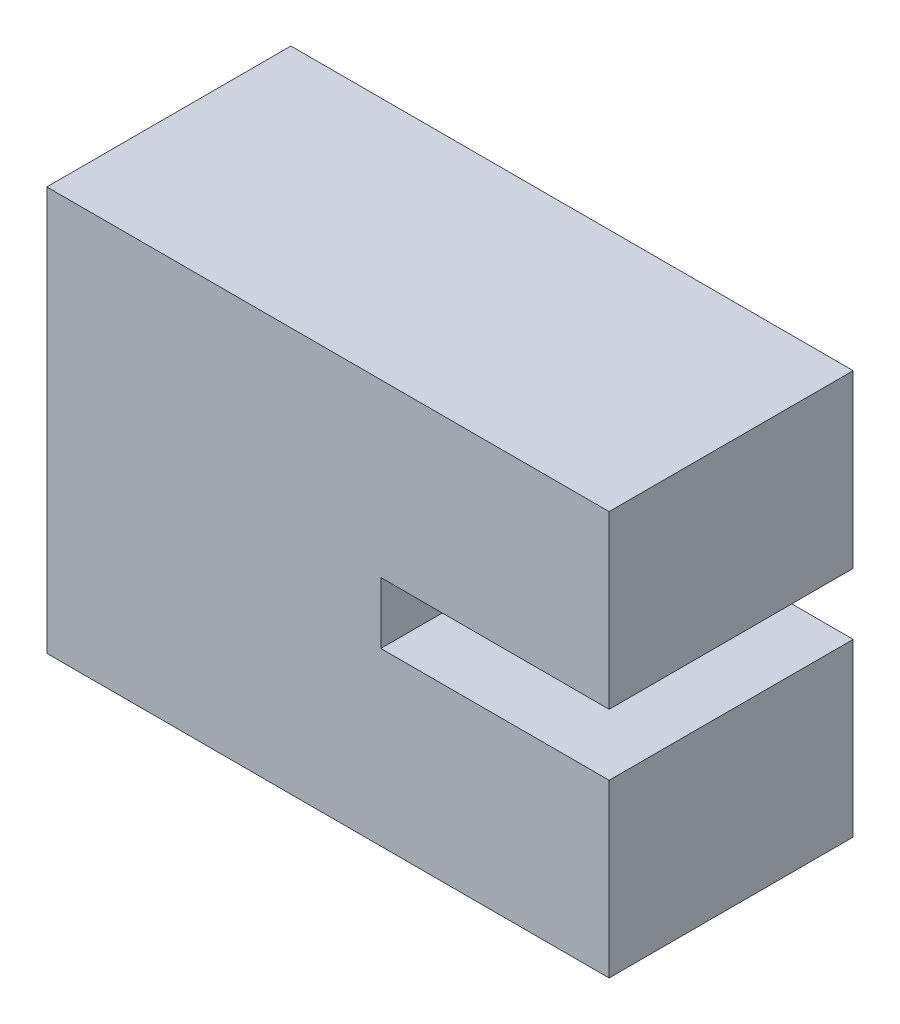
ISO-10303-21;
HEADER;
FILE_DESCRIPTION(('STEP AP214'),'2;1');
FILE_NAME('part.step','',(''),(''),'','','');
FILE_SCHEMA(('AUTOMOTIVE_DESIGN { 1 0 10303 214 1 1 1 1 }'));
ENDSEC;
DATA;
#1=APPLICATION_CONTEXT('core data for automotive mechanical design processes');
#2=APPLICATION_PROTOCOL_DEFINITION('international standard','automotive_design',2000,#1);
#3=PRODUCT_CONTEXT('',#1,'mechanical');
#4=PRODUCT('Part','Part','',(#3));
#5=PRODUCT_RELATED_PRODUCT_CATEGORY('part','',(#4));
#6=PRODUCT_DEFINITION_FORMATION('','',#4);
#7=PRODUCT_DEFINITION_CONTEXT('part definition',#1,'design');
#8=PRODUCT_DEFINITION('design','',#6,#7);
#9=PRODUCT_DEFINITION_SHAPE('','',#8);
#10=(LENGTH_UNIT() NAMED_UNIT(*) SI_UNIT(.MILLI.,.METRE.));
#11=(NAMED_UNIT(*) PLANE_ANGLE_UNIT() SI_UNIT($,.RADIAN.));
#12=(NAMED_UNIT(*) SI_UNIT($,.STERADIAN.) SOLID_ANGLE_UNIT());
#13=UNCERTAINTY_MEASURE_WITH_UNIT(LENGTH_MEASURE(1.E-05),#10,'distance_accuracy_value','');
#14=(GEOMETRIC_REPRESENTATION_CONTEXT(3) GLOBAL_UNCERTAINTY_ASSIGNED_CONTEXT((#13)) GLOBAL_UNIT_ASSIGNED_CONTEXT((#10,
#11,#12)) REPRESENTATION_CONTEXT('',''));
#15=CARTESIAN_POINT('',(0.,0.,0.));
#16=DIRECTION('',(0.,0.,1.));
#17=DIRECTION('',(1.,0.,0.));
#18=AXIS2_PLACEMENT_3D('',#15,#16,#17);
#19=CARTESIAN_POINT('',(19.7045905833706,0.,8.552959));
#20=DIRECTION('',(0.,1.,0.));
#21=DIRECTION('',(0.,0.,1.));
#22=AXIS2_PLACEMENT_3D('',#19,#20,#21);
#23=PLANE('',#22);
#24=DIRECTION('',(1.,0.,0.));
#25=VECTOR('',#24,1.);
#26=CARTESIAN_POINT('',(19.7045905833706,0.,0.));
#27=LINE('',#26,#25);
#28=CARTESIAN_POINT('',(0.,0.,0.));
#29=VERTEX_POINT('',#28);
#30=CARTESIAN_POINT('',(19.7045905833706,0.,0.));
#31=VERTEX_POINT('',#30);
#32=EDGE_CURVE('E129',#29,#31,#27,.T.);
#33=ORIENTED_EDGE('',*,*,#32,.T.);
#34=DIRECTION('',(0.,0.,-1.));
#35=VECTOR('',#34,1.);
#36=CARTESIAN_POINT('',(19.7045905833706,0.,8.552959));
#37=LINE('',#36,#35);
#38=CARTESIAN_POINT('',(19.7045905833706,0.,8.552959));
#39=VERTEX_POINT('',#38);
#40=EDGE_CURVE('E11',#39,#31,#37,.T.);
#41=ORIENTED_EDGE('',*,*,#40,.F.);
#42=DIRECTION('',(1.,0.,0.));
#43=VECTOR('',#42,1.);
#44=CARTESIAN_POINT('',(19.7045905833706,0.,8.552959));
#45=LINE('',#44,#43);
#46=CARTESIAN_POINT('',(0.,0.,8.552959));
#47=VERTEX_POINT('',#46);
#48=EDGE_CURVE('E143',#47,#39,#45,.T.);
#49=ORIENTED_EDGE('',*,*,#48,.F.);
#50=DIRECTION('',(0.,0.,-1.));
#51=VECTOR('',#50,1.);
#52=CARTESIAN_POINT('',(0.,0.,8.552959));
#53=LINE('',#52,#51);
#54=EDGE_CURVE('E125',#47,#29,#53,.T.);
#55=ORIENTED_EDGE('',*,*,#54,.T.);
#56=EDGE_LOOP('',(#33,#41,#49,#55));
#57=FACE_BOUND('',#56,.T.);
#58=ADVANCED_FACE('F33',(#57),#23,.F.);
#59=CARTESIAN_POINT('',(19.7045905833706,6.,8.552959));
#60=DIRECTION('',(-1.,0.,0.));
#61=DIRECTION('',(0.,-1.,0.));
#62=AXIS2_PLACEMENT_3D('',#59,#60,#61);
#63=PLANE('',#62);
#64=DIRECTION('',(0.,1.,0.));
#65=VECTOR('',#64,1.);
#66=CARTESIAN_POINT('',(19.7045905833706,6.,0.));
#67=LINE('',#66,#65);
#68=CARTESIAN_POINT('',(19.7045905833706,6.,0.));
#69=VERTEX_POINT('',#68);
#70=EDGE_CURVE('E132',#31,#69,#67,.T.);
#71=ORIENTED_EDGE('',*,*,#70,.T.);
#72=DIRECTION('',(0.,0.,-1.));
#73=VECTOR('',#72,1.);
#74=CARTESIAN_POINT('',(19.7045905833706,6.,8.552959));
#75=LINE('',#74,#73);
#76=CARTESIAN_POINT('',(19.7045905833706,6.,8.552959));
#77=VERTEX_POINT('',#76);
#78=EDGE_CURVE('E41',#77,#69,#75,.T.);
#79=ORIENTED_EDGE('',*,*,#78,.F.);
#80=DIRECTION('',(0.,1.,0.));
#81=VECTOR('',#80,1.);
#82=CARTESIAN_POINT('',(19.7045905833706,6.,8.552959));
#83=LINE('',#82,#81);
#84=EDGE_CURVE('E92',#39,#77,#83,.T.);
#85=ORIENTED_EDGE('',*,*,#84,.F.);
#86=ORIENTED_EDGE('',*,*,#40,.T.);
#87=EDGE_LOOP('',(#71,#79,#85,#86));
#88=FACE_BOUND('',#87,.T.);
#89=ADVANCED_FACE('F178',(#88),#63,.F.);
#90=CARTESIAN_POINT('',(11.7045905833706,6.,8.552959));
#91=DIRECTION('',(0.,-1.,0.));
#92=DIRECTION('',(1.,0.,0.));
#93=AXIS2_PLACEMENT_3D('',#90,#91,#92);
#94=PLANE('',#93);
#95=DIRECTION('',(-1.,0.,0.));
#96=VECTOR('',#95,1.);
#97=CARTESIAN_POINT('',(11.7045905833706,6.,0.));
#98=LINE('',#97,#96);
#99=CARTESIAN_POINT('',(11.7045905833706,6.,0.));
#100=VERTEX_POINT('',#99);
#101=EDGE_CURVE('E134',#69,#100,#98,.T.);
#102=ORIENTED_EDGE('',*,*,#101,.T.);
#103=DIRECTION('',(0.,0.,-1.));
#104=VECTOR('',#103,1.);
#105=CARTESIAN_POINT('',(11.7045905833706,6.,8.552959));
#106=LINE('',#105,#104);
#107=CARTESIAN_POINT('',(11.7045905833706,6.,8.552959));
#108=VERTEX_POINT('',#107);
#109=EDGE_CURVE('E150',#108,#100,#106,.T.);
#110=ORIENTED_EDGE('',*,*,#109,.F.);
#111=DIRECTION('',(-1.,0.,0.));
#112=VECTOR('',#111,1.);
#113=CARTESIAN_POINT('',(11.7045905833706,6.,8.552959));
#114=LINE('',#113,#112);
#115=EDGE_CURVE('E158',#77,#108,#114,.T.);
#116=ORIENTED_EDGE('',*,*,#115,.F.);
#117=ORIENTED_EDGE('',*,*,#78,.T.);
#118=EDGE_LOOP('',(#102,#110,#116,#117));
#119=FACE_BOUND('',#118,.T.);
#120=ADVANCED_FACE('F156',(#119),#94,.F.);
#121=CARTESIAN_POINT('',(11.7045905833706,8.1536931,8.552959));
#122=DIRECTION('',(-1.,0.,0.));
#123=DIRECTION('',(0.,0.,1.));
#124=AXIS2_PLACEMENT_3D('',#121,#122,#123);
#125=PLANE('',#124);
#126=DIRECTION('',(0.,1.,0.));
#127=VECTOR('',#126,1.);
#128=CARTESIAN_POINT('',(11.7045905833706,8.1536931,0.));
#129=LINE('',#128,#127);
#130=CARTESIAN_POINT('',(11.7045905833706,8.1536931,0.));
#131=VERTEX_POINT('',#130);
#132=EDGE_CURVE('E136',#100,#131,#129,.T.);
#133=ORIENTED_EDGE('',*,*,#132,.T.);
#134=DIRECTION('',(0.,0.,-1.));
#135=VECTOR('',#134,1.);
#136=CARTESIAN_POINT('',(11.7045905833706,8.1536931,8.552959));
#137=LINE('',#136,#135);
#138=CARTESIAN_POINT('',(11.7045905833706,8.1536931,8.552959));
#139=VERTEX_POINT('',#138);
#140=EDGE_CURVE('E147',#139,#131,#137,.T.);
#141=ORIENTED_EDGE('',*,*,#140,.F.);
#142=DIRECTION('',(0.,1.,0.));
#143=VECTOR('',#142,1.);
#144=CARTESIAN_POINT('',(11.7045905833706,8.1536931,8.552959));
#145=LINE('',#144,#143);
#146=EDGE_CURVE('E170',#108,#139,#145,.T.);
#147=ORIENTED_EDGE('',*,*,#146,.F.);
#148=ORIENTED_EDGE('',*,*,#109,.T.);
#149=EDGE_LOOP('',(#133,#141,#147,#148));
#150=FACE_BOUND('',#149,.T.);
#151=ADVANCED_FACE('F166',(#150),#125,.F.);
#152=CARTESIAN_POINT('',(19.7045905833706,8.1536931,8.552959));
#153=DIRECTION('',(0.,1.,0.));
#154=DIRECTION('',(-1.,0.,0.));
#155=AXIS2_PLACEMENT_3D('',#152,#153,#154);
#156=PLANE('',#155);
#157=DIRECTION('',(1.,0.,0.));
#158=VECTOR('',#157,1.);
#159=CARTESIAN_POINT('',(19.7045905833706,8.1536931,0.));
#160=LINE('',#159,#158);
#161=CARTESIAN_POINT('',(19.7045905833706,8.1536931,0.));
#162=VERTEX_POINT('',#161);
#163=EDGE_CURVE('E138',#131,#162,#160,.T.);
#164=ORIENTED_EDGE('',*,*,#163,.T.);
#165=DIRECTION('',(0.,0.,-1.));
#166=VECTOR('',#165,1.);
#167=CARTESIAN_POINT('',(19.7045905833706,8.1536931,8.552959));
#168=LINE('',#167,#166);
#169=CARTESIAN_POINT('',(19.7045905833706,8.1536931,8.552959));
#170=VERTEX_POINT('',#169);
#171=EDGE_CURVE('E120',#170,#162,#168,.T.);
#172=ORIENTED_EDGE('',*,*,#171,.F.);
#173=DIRECTION('',(1.,0.,0.));
#174=VECTOR('',#173,1.);
#175=CARTESIAN_POINT('',(19.7045905833706,8.1536931,8.552959));
#176=LINE('',#175,#174);
#177=EDGE_CURVE('E111',#139,#170,#176,.T.);
#178=ORIENTED_EDGE('',*,*,#177,.F.);
#179=ORIENTED_EDGE('',*,*,#140,.T.);
#180=EDGE_LOOP('',(#164,#172,#178,#179));
#181=FACE_BOUND('',#180,.T.);
#182=ADVANCED_FACE('F169',(#181),#156,.F.);
#183=CARTESIAN_POINT('',(19.7045905833705,14.1536931,8.552959));
#184=DIRECTION('',(-1.,0.,0.));
#185=DIRECTION('',(0.,-1.,0.));
#186=AXIS2_PLACEMENT_3D('',#183,#184,#185);
#187=PLANE('',#186);
#188=DIRECTION('',(0.,1.,0.));
#189=VECTOR('',#188,1.);
#190=CARTESIAN_POINT('',(19.7045905833705,14.1536931,0.));
#191=LINE('',#190,#189);
#192=CARTESIAN_POINT('',(19.7045905833705,14.1536931,0.));
#193=VERTEX_POINT('',#192);
#194=EDGE_CURVE('E119',#162,#193,#191,.T.);
#195=ORIENTED_EDGE('',*,*,#194,.T.);
#196=DIRECTION('',(0.,0.,-1.));
#197=VECTOR('',#196,1.);
#198=CARTESIAN_POINT('',(19.7045905833705,14.1536931,8.552959));
#199=LINE('',#198,#197);
#200=CARTESIAN_POINT('',(19.7045905833705,14.1536931,8.552959));
#201=VERTEX_POINT('',#200);
#202=EDGE_CURVE('E116',#201,#193,#199,.T.);
#203=ORIENTED_EDGE('',*,*,#202,.F.);
#204=DIRECTION('',(0.,1.,0.));
#205=VECTOR('',#204,1.);
#206=CARTESIAN_POINT('',(19.7045905833705,14.1536931,8.552959));
#207=LINE('',#206,#205);
#208=EDGE_CURVE('E105',#170,#201,#207,.T.);
#209=ORIENTED_EDGE('',*,*,#208,.F.);
#210=ORIENTED_EDGE('',*,*,#171,.T.);
#211=EDGE_LOOP('',(#195,#203,#209,#210));
#212=FACE_BOUND('',#211,.T.);
#213=ADVANCED_FACE('F117',(#212),#187,.F.);
#214=CARTESIAN_POINT('',(0.,14.1536931,8.552959));
#215=DIRECTION('',(0.,-1.,0.));
#216=DIRECTION('',(0.,0.,-1.));
#217=AXIS2_PLACEMENT_3D('',#214,#215,#216);
#218=PLANE('',#217);
#219=DIRECTION('',(-1.,0.,0.));
#220=VECTOR('',#219,1.);
#221=CARTESIAN_POINT('',(0.,14.1536931,0.));
#222=LINE('',#221,#220);
#223=CARTESIAN_POINT('',(0.,14.1536931,0.));
#224=VERTEX_POINT('',#223);
#225=EDGE_CURVE('E78',#193,#224,#222,.T.);
#226=ORIENTED_EDGE('',*,*,#225,.T.);
#227=DIRECTION('',(0.,0.,-1.));
#228=VECTOR('',#227,1.);
#229=CARTESIAN_POINT('',(0.,14.1536931,8.552959));
#230=LINE('',#229,#228);
#231=CARTESIAN_POINT('',(0.,14.1536931,8.552959));
#232=VERTEX_POINT('',#231);
#233=EDGE_CURVE('E121',#232,#224,#230,.T.);
#234=ORIENTED_EDGE('',*,*,#233,.F.);
#235=DIRECTION('',(-1.,0.,0.));
#236=VECTOR('',#235,1.);
#237=CARTESIAN_POINT('',(0.,14.1536931,8.552959));
#238=LINE('',#237,#236);
#239=EDGE_CURVE('E109',#201,#232,#238,.T.);
#240=ORIENTED_EDGE('',*,*,#239,.F.);
#241=ORIENTED_EDGE('',*,*,#202,.T.);
#242=EDGE_LOOP('',(#226,#234,#240,#241));
#243=FACE_BOUND('',#242,.T.);
#244=ADVANCED_FACE('F123',(#243),#218,.F.);
#245=CARTESIAN_POINT('',(0.,0.,8.552959));
#246=DIRECTION('',(1.,0.,0.));
#247=DIRECTION('',(0.,0.,-1.));
#248=AXIS2_PLACEMENT_3D('',#245,#246,#247);
#249=PLANE('',#248);
#250=DIRECTION('',(0.,-1.,0.));
#251=VECTOR('',#250,1.);
#252=CARTESIAN_POINT('',(0.,0.,0.));
#253=LINE('',#252,#251);
#254=EDGE_CURVE('E84',#224,#29,#253,.T.);
#255=ORIENTED_EDGE('',*,*,#254,.T.);
#256=ORIENTED_EDGE('',*,*,#54,.F.);
#257=DIRECTION('',(0.,-1.,0.));
#258=VECTOR('',#257,1.);
#259=CARTESIAN_POINT('',(0.,0.,8.552959));
#260=LINE('',#259,#258);
#261=EDGE_CURVE('E49',#232,#47,#260,.T.);
#262=ORIENTED_EDGE('',*,*,#261,.F.);
#263=ORIENTED_EDGE('',*,*,#233,.T.);
#264=EDGE_LOOP('',(#255,#256,#262,#263));
#265=FACE_BOUND('',#264,.T.);
#266=ADVANCED_FACE('F194',(#265),#249,.F.);
#267=CARTESIAN_POINT('',(0.,0.,8.552959));
#268=DIRECTION('',(0.,0.,-1.));
#269=DIRECTION('',(-1.,0.,0.));
#270=AXIS2_PLACEMENT_3D('',#267,#268,#269);
#271=PLANE('',#270);
#272=ORIENTED_EDGE('',*,*,#48,.T.);
#273=ORIENTED_EDGE('',*,*,#84,.T.);
#274=ORIENTED_EDGE('',*,*,#115,.T.);
#275=ORIENTED_EDGE('',*,*,#146,.T.);
#276=ORIENTED_EDGE('',*,*,#177,.T.);
#277=ORIENTED_EDGE('',*,*,#208,.T.);
#278=ORIENTED_EDGE('',*,*,#239,.T.);
#279=ORIENTED_EDGE('',*,*,#261,.T.);
#280=EDGE_LOOP('',(#272,#273,#274,#275,#276,#277,#278,#279));
#281=FACE_BOUND('',#280,.T.);
#282=ADVANCED_FACE('F107',(#281),#271,.F.);
#283=CARTESIAN_POINT('',(0.,0.,0.));
#284=DIRECTION('',(0.,0.,-1.));
#285=DIRECTION('',(-1.,0.,0.));
#286=AXIS2_PLACEMENT_3D('',#283,#284,#285);
#287=PLANE('',#286);
#288=ORIENTED_EDGE('',*,*,#32,.F.);
#289=ORIENTED_EDGE('',*,*,#254,.F.);
#290=ORIENTED_EDGE('',*,*,#225,.F.);
#291=ORIENTED_EDGE('',*,*,#194,.F.);
#292=ORIENTED_EDGE('',*,*,#163,.F.);
#293=ORIENTED_EDGE('',*,*,#132,.F.);
#294=ORIENTED_EDGE('',*,*,#101,.F.);
#295=ORIENTED_EDGE('',*,*,#70,.F.);
#296=EDGE_LOOP('',(#288,#289,#290,#291,#292,#293,#294,#295));
#297=FACE_BOUND('',#296,.T.);
#298=ADVANCED_FACE('F162',(#297),#287,.T.);
#299=CLOSED_SHELL('',(#58,#89,#120,#151,#182,#213,#244,#266,#282,#298));
#300=MANIFOLD_SOLID_BREP('B2',#299);
#301=ADVANCED_BREP_SHAPE_REPRESENTATION('',(#18,#300),#14);
#302=SHAPE_DEFINITION_REPRESENTATION(#9,#301);
ENDSEC;
END-ISO-10303-21;
